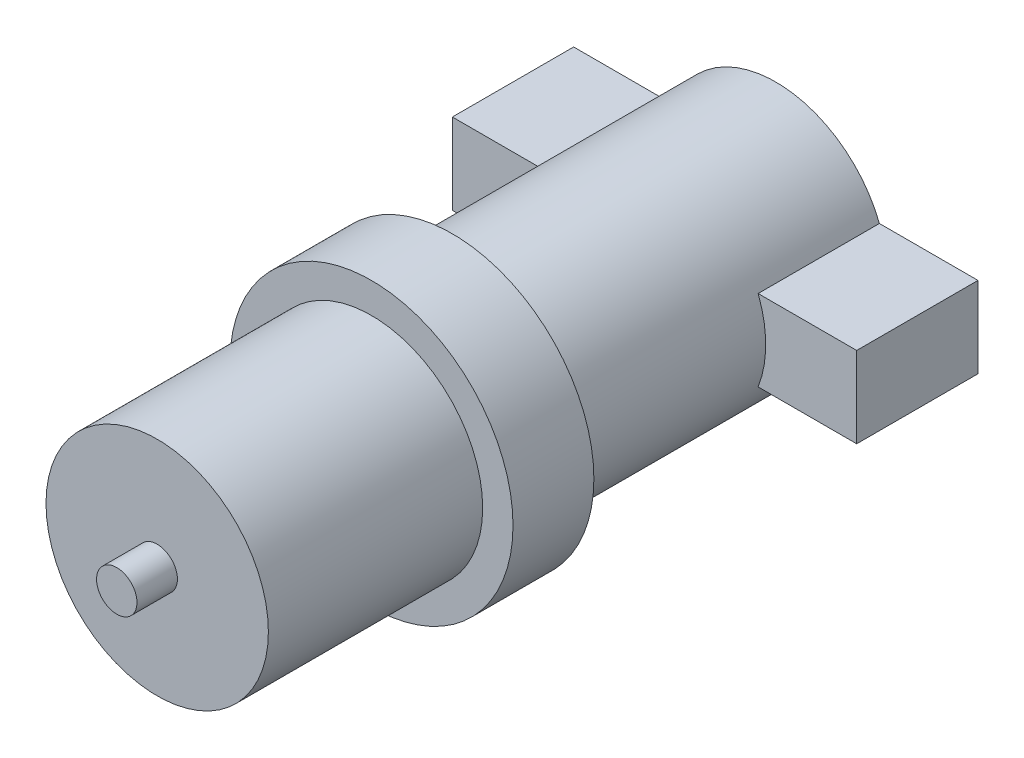
ISO-10303-21;
HEADER;
FILE_DESCRIPTION(('STEP AP214'),'2;1');
FILE_NAME('part.step','',(''),(''),'','','');
FILE_SCHEMA(('AUTOMOTIVE_DESIGN { 1 0 10303 214 1 1 1 1 }'));
ENDSEC;
DATA;
#1=APPLICATION_CONTEXT('core data for automotive mechanical design processes');
#2=APPLICATION_PROTOCOL_DEFINITION('international standard','automotive_design',2000,#1);
#3=PRODUCT_CONTEXT('',#1,'mechanical');
#4=PRODUCT('Part','Part','',(#3));
#5=PRODUCT_RELATED_PRODUCT_CATEGORY('part','',(#4));
#6=PRODUCT_DEFINITION_FORMATION('','',#4);
#7=PRODUCT_DEFINITION_CONTEXT('part definition',#1,'design');
#8=PRODUCT_DEFINITION('design','',#6,#7);
#9=PRODUCT_DEFINITION_SHAPE('','',#8);
#10=(LENGTH_UNIT() NAMED_UNIT(*) SI_UNIT(.MILLI.,.METRE.));
#11=(NAMED_UNIT(*) PLANE_ANGLE_UNIT() SI_UNIT($,.RADIAN.));
#12=(NAMED_UNIT(*) SI_UNIT($,.STERADIAN.) SOLID_ANGLE_UNIT());
#13=UNCERTAINTY_MEASURE_WITH_UNIT(LENGTH_MEASURE(1.E-05),#10,'distance_accuracy_value','');
#14=(GEOMETRIC_REPRESENTATION_CONTEXT(3) GLOBAL_UNCERTAINTY_ASSIGNED_CONTEXT((#13)) GLOBAL_UNIT_ASSIGNED_CONTEXT((#10,
#11,#12)) REPRESENTATION_CONTEXT('',''));
#15=CARTESIAN_POINT('',(0.,0.,0.));
#16=DIRECTION('',(0.,0.,1.));
#17=DIRECTION('',(1.,0.,0.));
#18=AXIS2_PLACEMENT_3D('',#15,#16,#17);
#19=CARTESIAN_POINT('',(0.,0.,7.5));
#20=DIRECTION('',(0.,0.,-1.));
#21=DIRECTION('',(-1.,0.,0.));
#22=AXIS2_PLACEMENT_3D('',#19,#20,#21);
#23=CYLINDRICAL_SURFACE('',#22,6.875);
#24=CARTESIAN_POINT('',(0.,0.,-5.));
#25=DIRECTION('',(0.,0.,1.));
#26=DIRECTION('',(1.,0.,0.));
#27=AXIS2_PLACEMENT_3D('',#24,#25,#26);
#28=CIRCLE('',#27,6.875);
#29=CARTESIAN_POINT('',(-6.40434422872475,2.5,-5.));
#30=VERTEX_POINT('',#29);
#31=CARTESIAN_POINT('',(-6.40434422872475,-2.5,-5.));
#32=VERTEX_POINT('',#31);
#33=EDGE_CURVE('E11',#30,#32,#28,.T.);
#34=ORIENTED_EDGE('',*,*,#33,.T.);
#35=DIRECTION('',(0.,0.,-1.));
#36=VECTOR('',#35,1.);
#37=CARTESIAN_POINT('',(-6.40434422872475,-2.5,7.5));
#38=LINE('',#37,#36);
#39=CARTESIAN_POINT('',(-6.40434422872475,-2.5,-12.5));
#40=VERTEX_POINT('',#39);
#41=EDGE_CURVE('E152',#32,#40,#38,.T.);
#42=ORIENTED_EDGE('',*,*,#41,.T.);
#43=CARTESIAN_POINT('',(0.,0.,-12.5));
#44=DIRECTION('',(0.,0.,-1.));
#45=DIRECTION('',(-1.,0.,0.));
#46=AXIS2_PLACEMENT_3D('',#43,#44,#45);
#47=CIRCLE('',#46,6.875);
#48=CARTESIAN_POINT('',(6.40434422872475,-2.5,-12.5));
#49=VERTEX_POINT('',#48);
#50=EDGE_CURVE('E155',#49,#40,#47,.T.);
#51=ORIENTED_EDGE('',*,*,#50,.F.);
#52=DIRECTION('',(0.,0.,-1.));
#53=VECTOR('',#52,1.);
#54=CARTESIAN_POINT('',(6.40434422872475,-2.5,7.5));
#55=LINE('',#54,#53);
#56=CARTESIAN_POINT('',(6.40434422872475,-2.5,-5.));
#57=VERTEX_POINT('',#56);
#58=EDGE_CURVE('E149',#49,#57,#55,.F.);
#59=ORIENTED_EDGE('',*,*,#58,.T.);
#60=CARTESIAN_POINT('',(6.40434422872475,2.5,-5.));
#61=VERTEX_POINT('',#60);
#62=EDGE_CURVE('E38',#57,#61,#28,.T.);
#63=ORIENTED_EDGE('',*,*,#62,.T.);
#64=DIRECTION('',(0.,0.,-1.));
#65=VECTOR('',#64,1.);
#66=CARTESIAN_POINT('',(6.40434422872475,2.5,7.5));
#67=LINE('',#66,#65);
#68=CARTESIAN_POINT('',(6.40434422872475,2.5,-12.5));
#69=VERTEX_POINT('',#68);
#70=EDGE_CURVE('E146',#61,#69,#67,.T.);
#71=ORIENTED_EDGE('',*,*,#70,.T.);
#72=CARTESIAN_POINT('',(-6.40434422872475,2.5,-12.5));
#73=VERTEX_POINT('',#72);
#74=EDGE_CURVE('E156',#73,#69,#47,.T.);
#75=ORIENTED_EDGE('',*,*,#74,.F.);
#76=DIRECTION('',(0.,0.,-1.));
#77=VECTOR('',#76,1.);
#78=CARTESIAN_POINT('',(-6.40434422872475,2.5,7.5));
#79=LINE('',#78,#77);
#80=EDGE_CURVE('E140',#73,#30,#79,.F.);
#81=ORIENTED_EDGE('',*,*,#80,.T.);
#82=EDGE_LOOP('',(#34,#42,#51,#59,#63,#71,#75,#81));
#83=FACE_BOUND('',#82,.T.);
#84=CARTESIAN_POINT('',(0.,0.,7.5));
#85=DIRECTION('',(0.,0.,1.));
#86=DIRECTION('',(1.,0.,0.));
#87=AXIS2_PLACEMENT_3D('',#84,#85,#86);
#88=CIRCLE('',#87,6.875);
#89=CARTESIAN_POINT('',(6.875,0.,7.5));
#90=VERTEX_POINT('',#89);
#91=EDGE_CURVE('E171',#90,#90,#88,.T.);
#92=ORIENTED_EDGE('',*,*,#91,.F.);
#93=EDGE_LOOP('',(#92));
#94=FACE_BOUND('',#93,.T.);
#95=ADVANCED_FACE('F35',(#83,#94),#23,.T.);
#96=CARTESIAN_POINT('',(0.,0.,12.5));
#97=DIRECTION('',(0.,0.,-1.));
#98=DIRECTION('',(-1.,0.,0.));
#99=AXIS2_PLACEMENT_3D('',#96,#97,#98);
#100=CYLINDRICAL_SURFACE('',#99,8.75);
#101=CARTESIAN_POINT('',(0.,0.,12.5));
#102=DIRECTION('',(0.,0.,1.));
#103=DIRECTION('',(1.,0.,0.));
#104=AXIS2_PLACEMENT_3D('',#101,#102,#103);
#105=CIRCLE('',#104,8.75);
#106=CARTESIAN_POINT('',(8.75,0.,12.5));
#107=VERTEX_POINT('',#106);
#108=EDGE_CURVE('E172',#107,#107,#105,.T.);
#109=ORIENTED_EDGE('',*,*,#108,.F.);
#110=EDGE_LOOP('',(#109));
#111=FACE_BOUND('',#110,.T.);
#112=CARTESIAN_POINT('',(0.,0.,7.5));
#113=DIRECTION('',(0.,0.,1.));
#114=DIRECTION('',(1.,0.,0.));
#115=AXIS2_PLACEMENT_3D('',#112,#113,#114);
#116=CIRCLE('',#115,8.75);
#117=CARTESIAN_POINT('',(8.75,0.,7.5));
#118=VERTEX_POINT('',#117);
#119=EDGE_CURVE('E168',#118,#118,#116,.T.);
#120=ORIENTED_EDGE('',*,*,#119,.T.);
#121=EDGE_LOOP('',(#120));
#122=FACE_BOUND('',#121,.T.);
#123=ADVANCED_FACE('F183',(#111,#122),#100,.T.);
#124=CARTESIAN_POINT('',(0.,0.,12.5));
#125=DIRECTION('',(0.,0.,1.));
#126=DIRECTION('',(1.,0.,0.));
#127=AXIS2_PLACEMENT_3D('',#124,#125,#126);
#128=PLANE('',#127);
#129=CARTESIAN_POINT('',(0.,0.,12.5));
#130=DIRECTION('',(0.,0.,1.));
#131=DIRECTION('',(1.,0.,0.));
#132=AXIS2_PLACEMENT_3D('',#129,#130,#131);
#133=CIRCLE('',#132,6.875);
#134=CARTESIAN_POINT('',(6.875,0.,12.5));
#135=VERTEX_POINT('',#134);
#136=EDGE_CURVE('E165',#135,#135,#133,.T.);
#137=ORIENTED_EDGE('',*,*,#136,.F.);
#138=EDGE_LOOP('',(#137));
#139=FACE_BOUND('',#138,.T.);
#140=ORIENTED_EDGE('',*,*,#108,.T.);
#141=EDGE_LOOP('',(#140));
#142=FACE_BOUND('',#141,.T.);
#143=ADVANCED_FACE('F188',(#139,#142),#128,.T.);
#144=CARTESIAN_POINT('',(0.,0.,7.5));
#145=DIRECTION('',(0.,0.,1.));
#146=DIRECTION('',(1.,0.,0.));
#147=AXIS2_PLACEMENT_3D('',#144,#145,#146);
#148=PLANE('',#147);
#149=ORIENTED_EDGE('',*,*,#91,.T.);
#150=EDGE_LOOP('',(#149));
#151=FACE_BOUND('',#150,.T.);
#152=ORIENTED_EDGE('',*,*,#119,.F.);
#153=EDGE_LOOP('',(#152));
#154=FACE_BOUND('',#153,.T.);
#155=ADVANCED_FACE('F179',(#151,#154),#148,.F.);
#156=CARTESIAN_POINT('',(0.,0.,25.75));
#157=DIRECTION('',(0.,0.,-1.));
#158=DIRECTION('',(-1.,0.,0.));
#159=AXIS2_PLACEMENT_3D('',#156,#157,#158);
#160=CYLINDRICAL_SURFACE('',#159,6.875);
#161=CARTESIAN_POINT('',(0.,0.,25.75));
#162=DIRECTION('',(0.,0.,1.));
#163=DIRECTION('',(1.,0.,0.));
#164=AXIS2_PLACEMENT_3D('',#161,#162,#163);
#165=CIRCLE('',#164,6.875);
#166=CARTESIAN_POINT('',(6.875,0.,25.75));
#167=VERTEX_POINT('',#166);
#168=EDGE_CURVE('E161',#167,#167,#165,.T.);
#169=ORIENTED_EDGE('',*,*,#168,.F.);
#170=EDGE_LOOP('',(#169));
#171=FACE_BOUND('',#170,.T.);
#172=ORIENTED_EDGE('',*,*,#136,.T.);
#173=EDGE_LOOP('',(#172));
#174=FACE_BOUND('',#173,.T.);
#175=ADVANCED_FACE('F241',(#171,#174),#160,.T.);
#176=CARTESIAN_POINT('',(0.,0.,25.75));
#177=DIRECTION('',(0.,0.,1.));
#178=DIRECTION('',(1.,0.,0.));
#179=AXIS2_PLACEMENT_3D('',#176,#177,#178);
#180=PLANE('',#179);
#181=CARTESIAN_POINT('',(0.,0.,25.75));
#182=DIRECTION('',(0.,0.,1.));
#183=DIRECTION('',(1.,0.,0.));
#184=AXIS2_PLACEMENT_3D('',#181,#182,#183);
#185=CIRCLE('',#184,1.25);
#186=CARTESIAN_POINT('',(1.25,0.,25.75));
#187=VERTEX_POINT('',#186);
#188=EDGE_CURVE('E162',#187,#187,#185,.T.);
#189=ORIENTED_EDGE('',*,*,#188,.F.);
#190=EDGE_LOOP('',(#189));
#191=FACE_BOUND('',#190,.T.);
#192=ORIENTED_EDGE('',*,*,#168,.T.);
#193=EDGE_LOOP('',(#192));
#194=FACE_BOUND('',#193,.T.);
#195=ADVANCED_FACE('F237',(#191,#194),#180,.T.);
#196=CARTESIAN_POINT('',(0.,0.,28.25));
#197=DIRECTION('',(0.,0.,-1.));
#198=DIRECTION('',(-1.,0.,0.));
#199=AXIS2_PLACEMENT_3D('',#196,#197,#198);
#200=CYLINDRICAL_SURFACE('',#199,1.25);
#201=CARTESIAN_POINT('',(0.,0.,28.25));
#202=DIRECTION('',(0.,0.,1.));
#203=DIRECTION('',(1.,0.,0.));
#204=AXIS2_PLACEMENT_3D('',#201,#202,#203);
#205=CIRCLE('',#204,1.25);
#206=CARTESIAN_POINT('',(1.25,0.,28.25));
#207=VERTEX_POINT('',#206);
#208=EDGE_CURVE('E158',#207,#207,#205,.T.);
#209=ORIENTED_EDGE('',*,*,#208,.F.);
#210=EDGE_LOOP('',(#209));
#211=FACE_BOUND('',#210,.T.);
#212=ORIENTED_EDGE('',*,*,#188,.T.);
#213=EDGE_LOOP('',(#212));
#214=FACE_BOUND('',#213,.T.);
#215=ADVANCED_FACE('F233',(#211,#214),#200,.T.);
#216=CARTESIAN_POINT('',(0.,0.,28.25));
#217=DIRECTION('',(0.,0.,1.));
#218=DIRECTION('',(1.,0.,0.));
#219=AXIS2_PLACEMENT_3D('',#216,#217,#218);
#220=PLANE('',#219);
#221=ORIENTED_EDGE('',*,*,#208,.T.);
#222=EDGE_LOOP('',(#221));
#223=FACE_BOUND('',#222,.T.);
#224=ADVANCED_FACE('F230',(#223),#220,.T.);
#225=CARTESIAN_POINT('',(0.,0.,-12.5));
#226=DIRECTION('',(0.,0.,-1.));
#227=DIRECTION('',(-1.,0.,0.));
#228=AXIS2_PLACEMENT_3D('',#225,#226,#227);
#229=PLANE('',#228);
#230=ORIENTED_EDGE('',*,*,#74,.T.);
#231=DIRECTION('',(1.,0.,0.));
#232=VECTOR('',#231,1.);
#233=CARTESIAN_POINT('',(12.5,2.5,-12.5));
#234=LINE('',#233,#232);
#235=CARTESIAN_POINT('',(12.5,2.5,-12.5));
#236=VERTEX_POINT('',#235);
#237=EDGE_CURVE('E135',#69,#236,#234,.T.);
#238=ORIENTED_EDGE('',*,*,#237,.T.);
#239=DIRECTION('',(0.,-1.,0.));
#240=VECTOR('',#239,1.);
#241=CARTESIAN_POINT('',(12.5,-2.5,-12.5));
#242=LINE('',#241,#240);
#243=CARTESIAN_POINT('',(12.5,-2.5,-12.5));
#244=VERTEX_POINT('',#243);
#245=EDGE_CURVE('E137',#236,#244,#242,.T.);
#246=ORIENTED_EDGE('',*,*,#245,.T.);
#247=DIRECTION('',(-1.,0.,0.));
#248=VECTOR('',#247,1.);
#249=CARTESIAN_POINT('',(12.5,-2.5,-12.5));
#250=LINE('',#249,#248);
#251=EDGE_CURVE('E49',#244,#49,#250,.T.);
#252=ORIENTED_EDGE('',*,*,#251,.T.);
#253=ORIENTED_EDGE('',*,*,#50,.T.);
#254=CARTESIAN_POINT('',(-12.5,-2.5,-12.5));
#255=VERTEX_POINT('',#254);
#256=EDGE_CURVE('E125',#40,#255,#250,.T.);
#257=ORIENTED_EDGE('',*,*,#256,.T.);
#258=DIRECTION('',(0.,1.,0.));
#259=VECTOR('',#258,1.);
#260=CARTESIAN_POINT('',(-12.5,-2.5,-12.5));
#261=LINE('',#260,#259);
#262=CARTESIAN_POINT('',(-12.5,2.5,-12.5));
#263=VERTEX_POINT('',#262);
#264=EDGE_CURVE('E133',#255,#263,#261,.T.);
#265=ORIENTED_EDGE('',*,*,#264,.T.);
#266=EDGE_CURVE('E56',#263,#73,#234,.T.);
#267=ORIENTED_EDGE('',*,*,#266,.T.);
#268=EDGE_LOOP('',(#230,#238,#246,#252,#253,#257,#265,#267));
#269=FACE_BOUND('',#268,.T.);
#270=ADVANCED_FACE('F193',(#269),#229,.T.);
#271=CARTESIAN_POINT('',(12.5,-2.5,-5.));
#272=DIRECTION('',(1.,0.,0.));
#273=DIRECTION('',(0.,0.,-1.));
#274=AXIS2_PLACEMENT_3D('',#271,#272,#273);
#275=PLANE('',#274);
#276=ORIENTED_EDGE('',*,*,#245,.F.);
#277=DIRECTION('',(0.,0.,-1.));
#278=VECTOR('',#277,1.);
#279=CARTESIAN_POINT('',(12.5,2.5,-5.));
#280=LINE('',#279,#278);
#281=CARTESIAN_POINT('',(12.5,2.5,-5.));
#282=VERTEX_POINT('',#281);
#283=EDGE_CURVE('E109',#282,#236,#280,.T.);
#284=ORIENTED_EDGE('',*,*,#283,.F.);
#285=DIRECTION('',(0.,-1.,0.));
#286=VECTOR('',#285,1.);
#287=CARTESIAN_POINT('',(12.5,-2.5,-5.));
#288=LINE('',#287,#286);
#289=CARTESIAN_POINT('',(12.5,-2.5,-5.));
#290=VERTEX_POINT('',#289);
#291=EDGE_CURVE('E117',#282,#290,#288,.T.);
#292=ORIENTED_EDGE('',*,*,#291,.T.);
#293=DIRECTION('',(0.,0.,-1.));
#294=VECTOR('',#293,1.);
#295=CARTESIAN_POINT('',(12.5,-2.5,-5.));
#296=LINE('',#295,#294);
#297=EDGE_CURVE('E141',#290,#244,#296,.T.);
#298=ORIENTED_EDGE('',*,*,#297,.T.);
#299=EDGE_LOOP('',(#276,#284,#292,#298));
#300=FACE_BOUND('',#299,.T.);
#301=ADVANCED_FACE('F201',(#300),#275,.T.);
#302=CARTESIAN_POINT('',(0.,0.,-5.));
#303=DIRECTION('',(0.,0.,1.));
#304=DIRECTION('',(1.,0.,0.));
#305=AXIS2_PLACEMENT_3D('',#302,#303,#304);
#306=PLANE('',#305);
#307=ORIENTED_EDGE('',*,*,#62,.F.);
#308=DIRECTION('',(-1.,0.,0.));
#309=VECTOR('',#308,1.);
#310=CARTESIAN_POINT('',(12.5,-2.5,-5.));
#311=LINE('',#310,#309);
#312=EDGE_CURVE('E110',#290,#57,#311,.T.);
#313=ORIENTED_EDGE('',*,*,#312,.F.);
#314=ORIENTED_EDGE('',*,*,#291,.F.);
#315=DIRECTION('',(1.,0.,0.));
#316=VECTOR('',#315,1.);
#317=CARTESIAN_POINT('',(12.5,2.5,-5.));
#318=LINE('',#317,#316);
#319=EDGE_CURVE('E118',#61,#282,#318,.T.);
#320=ORIENTED_EDGE('',*,*,#319,.F.);
#321=EDGE_LOOP('',(#307,#313,#314,#320));
#322=FACE_BOUND('',#321,.T.);
#323=ADVANCED_FACE('F215',(#322),#306,.T.);
#324=CARTESIAN_POINT('',(12.5,2.5,-5.));
#325=DIRECTION('',(0.,1.,0.));
#326=DIRECTION('',(0.,0.,1.));
#327=AXIS2_PLACEMENT_3D('',#324,#325,#326);
#328=PLANE('',#327);
#329=ORIENTED_EDGE('',*,*,#70,.F.);
#330=ORIENTED_EDGE('',*,*,#319,.T.);
#331=ORIENTED_EDGE('',*,*,#283,.T.);
#332=ORIENTED_EDGE('',*,*,#237,.F.);
#333=EDGE_LOOP('',(#329,#330,#331,#332));
#334=FACE_BOUND('',#333,.T.);
#335=ADVANCED_FACE('F197',(#334),#328,.T.);
#336=CARTESIAN_POINT('',(12.5,-2.5,-5.));
#337=DIRECTION('',(0.,-1.,0.));
#338=DIRECTION('',(0.,0.,-1.));
#339=AXIS2_PLACEMENT_3D('',#336,#337,#338);
#340=PLANE('',#339);
#341=ORIENTED_EDGE('',*,*,#58,.F.);
#342=ORIENTED_EDGE('',*,*,#251,.F.);
#343=ORIENTED_EDGE('',*,*,#297,.F.);
#344=ORIENTED_EDGE('',*,*,#312,.T.);
#345=EDGE_LOOP('',(#341,#342,#343,#344));
#346=FACE_BOUND('',#345,.T.);
#347=ADVANCED_FACE('F204',(#346),#340,.T.);
#348=ORIENTED_EDGE('',*,*,#33,.F.);
#349=CARTESIAN_POINT('',(-12.5,2.5,-5.));
#350=VERTEX_POINT('',#349);
#351=EDGE_CURVE('E104',#350,#30,#318,.T.);
#352=ORIENTED_EDGE('',*,*,#351,.F.);
#353=DIRECTION('',(0.,1.,0.));
#354=VECTOR('',#353,1.);
#355=CARTESIAN_POINT('',(-12.5,-2.5,-5.));
#356=LINE('',#355,#354);
#357=CARTESIAN_POINT('',(-12.5,-2.5,-5.));
#358=VERTEX_POINT('',#357);
#359=EDGE_CURVE('E116',#358,#350,#356,.T.);
#360=ORIENTED_EDGE('',*,*,#359,.F.);
#361=EDGE_CURVE('E130',#32,#358,#311,.T.);
#362=ORIENTED_EDGE('',*,*,#361,.F.);
#363=EDGE_LOOP('',(#348,#352,#360,#362));
#364=FACE_BOUND('',#363,.T.);
#365=ADVANCED_FACE('F114',(#364),#306,.T.);
#366=ORIENTED_EDGE('',*,*,#41,.F.);
#367=ORIENTED_EDGE('',*,*,#361,.T.);
#368=DIRECTION('',(0.,0.,-1.));
#369=VECTOR('',#368,1.);
#370=CARTESIAN_POINT('',(-12.5,-2.5,-5.));
#371=LINE('',#370,#369);
#372=EDGE_CURVE('E123',#358,#255,#371,.T.);
#373=ORIENTED_EDGE('',*,*,#372,.T.);
#374=ORIENTED_EDGE('',*,*,#256,.F.);
#375=EDGE_LOOP('',(#366,#367,#373,#374));
#376=FACE_BOUND('',#375,.T.);
#377=ADVANCED_FACE('F206',(#376),#340,.T.);
#378=ORIENTED_EDGE('',*,*,#80,.F.);
#379=ORIENTED_EDGE('',*,*,#266,.F.);
#380=DIRECTION('',(0.,0.,-1.));
#381=VECTOR('',#380,1.);
#382=CARTESIAN_POINT('',(-12.5,2.5,-5.));
#383=LINE('',#382,#381);
#384=EDGE_CURVE('E101',#350,#263,#383,.T.);
#385=ORIENTED_EDGE('',*,*,#384,.F.);
#386=ORIENTED_EDGE('',*,*,#351,.T.);
#387=EDGE_LOOP('',(#378,#379,#385,#386));
#388=FACE_BOUND('',#387,.T.);
#389=ADVANCED_FACE('F103',(#388),#328,.T.);
#390=CARTESIAN_POINT('',(-12.5,-2.5,-5.));
#391=DIRECTION('',(-1.,0.,0.));
#392=DIRECTION('',(0.,0.,1.));
#393=AXIS2_PLACEMENT_3D('',#390,#391,#392);
#394=PLANE('',#393);
#395=ORIENTED_EDGE('',*,*,#264,.F.);
#396=ORIENTED_EDGE('',*,*,#372,.F.);
#397=ORIENTED_EDGE('',*,*,#359,.T.);
#398=ORIENTED_EDGE('',*,*,#384,.T.);
#399=EDGE_LOOP('',(#395,#396,#397,#398));
#400=FACE_BOUND('',#399,.T.);
#401=ADVANCED_FACE('F121',(#400),#394,.T.);
#402=CLOSED_SHELL('',(#95,#123,#143,#155,#175,#195,#215,#224,#270,#301,#323,#335,#347,#365,#377,
#389,#401));
#403=MANIFOLD_SOLID_BREP('B2',#402);
#404=ADVANCED_BREP_SHAPE_REPRESENTATION('',(#18,#403),#14);
#405=SHAPE_DEFINITION_REPRESENTATION(#9,#404);
ENDSEC;
END-ISO-10303-21;
